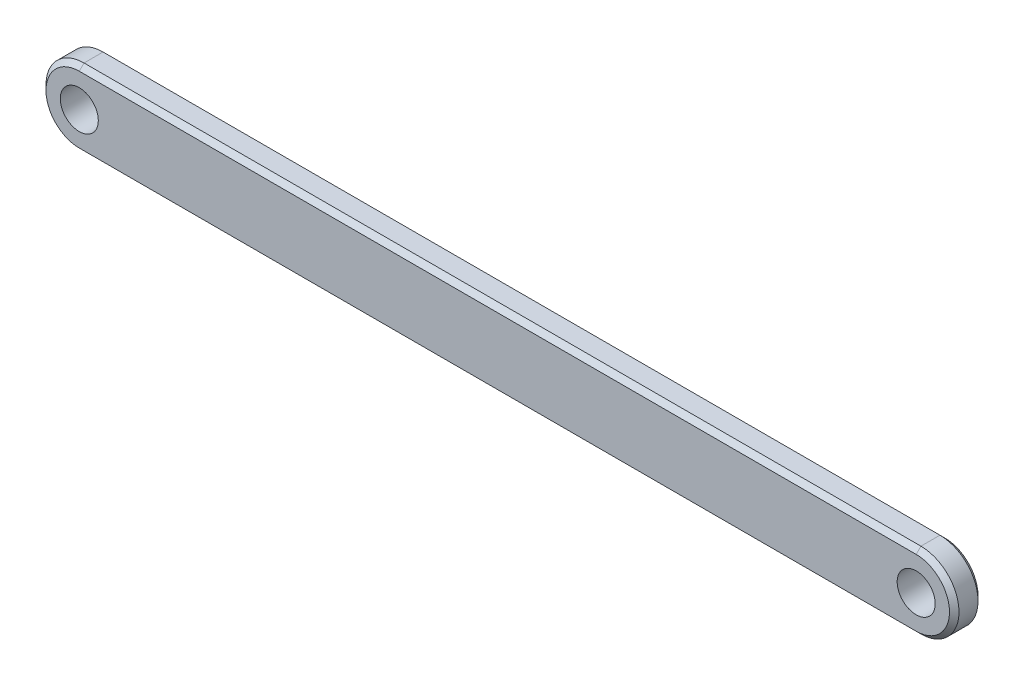
ISO-10303-21;
HEADER;
FILE_DESCRIPTION(('STEP AP214'),'2;1');
FILE_NAME('part.step','',(''),(''),'','','');
FILE_SCHEMA(('AUTOMOTIVE_DESIGN { 1 0 10303 214 1 1 1 1 }'));
ENDSEC;
DATA;
#1=APPLICATION_CONTEXT('core data for automotive mechanical design processes');
#2=APPLICATION_PROTOCOL_DEFINITION('international standard','automotive_design',2000,#1);
#3=PRODUCT_CONTEXT('',#1,'mechanical');
#4=PRODUCT('Part','Part','',(#3));
#5=PRODUCT_RELATED_PRODUCT_CATEGORY('part','',(#4));
#6=PRODUCT_DEFINITION_FORMATION('','',#4);
#7=PRODUCT_DEFINITION_CONTEXT('part definition',#1,'design');
#8=PRODUCT_DEFINITION('design','',#6,#7);
#9=PRODUCT_DEFINITION_SHAPE('','',#8);
#10=(LENGTH_UNIT() NAMED_UNIT(*) SI_UNIT(.MILLI.,.METRE.));
#11=(NAMED_UNIT(*) PLANE_ANGLE_UNIT() SI_UNIT($,.RADIAN.));
#12=(NAMED_UNIT(*) SI_UNIT($,.STERADIAN.) SOLID_ANGLE_UNIT());
#13=UNCERTAINTY_MEASURE_WITH_UNIT(LENGTH_MEASURE(1.E-05),#10,'distance_accuracy_value','');
#14=(GEOMETRIC_REPRESENTATION_CONTEXT(3) GLOBAL_UNCERTAINTY_ASSIGNED_CONTEXT((#13)) GLOBAL_UNIT_ASSIGNED_CONTEXT((#10,
#11,#12)) REPRESENTATION_CONTEXT('',''));
#15=CARTESIAN_POINT('',(0.,0.,0.));
#16=DIRECTION('',(0.,0.,1.));
#17=DIRECTION('',(1.,0.,0.));
#18=AXIS2_PLACEMENT_3D('',#15,#16,#17);
#19=CARTESIAN_POINT('',(-44.,0.,1.5));
#20=DIRECTION('',(0.,0.,1.));
#21=DIRECTION('',(1.,0.,0.));
#22=AXIS2_PLACEMENT_3D('',#19,#20,#21);
#23=PLANE('',#22);
#24=DIRECTION('',(1.,0.,0.));
#25=VECTOR('',#24,1.);
#26=CARTESIAN_POINT('',(44.,-3.49999999999998,1.5));
#27=LINE('',#26,#25);
#28=CARTESIAN_POINT('',(-44.,-3.5,1.5));
#29=VERTEX_POINT('',#28);
#30=CARTESIAN_POINT('',(44.,-3.49999999999998,1.5));
#31=VERTEX_POINT('',#30);
#32=EDGE_CURVE('E57',#29,#31,#27,.T.);
#33=ORIENTED_EDGE('',*,*,#32,.T.);
#34=CARTESIAN_POINT('',(44.,0.,1.5));
#35=DIRECTION('',(0.,0.,1.));
#36=DIRECTION('',(1.,0.,0.));
#37=AXIS2_PLACEMENT_3D('',#34,#35,#36);
#38=CIRCLE('',#37,3.5);
#39=CARTESIAN_POINT('',(44.,3.50000000000002,1.5));
#40=VERTEX_POINT('',#39);
#41=EDGE_CURVE('E11',#31,#40,#38,.T.);
#42=ORIENTED_EDGE('',*,*,#41,.T.);
#43=DIRECTION('',(-1.,0.,0.));
#44=VECTOR('',#43,1.);
#45=CARTESIAN_POINT('',(-44.,3.5,1.5));
#46=LINE('',#45,#44);
#47=CARTESIAN_POINT('',(-44.,3.5,1.5));
#48=VERTEX_POINT('',#47);
#49=EDGE_CURVE('E42',#40,#48,#46,.T.);
#50=ORIENTED_EDGE('',*,*,#49,.T.);
#51=CARTESIAN_POINT('',(-44.,0.,1.5));
#52=DIRECTION('',(0.,0.,1.));
#53=DIRECTION('',(1.,0.,0.));
#54=AXIS2_PLACEMENT_3D('',#51,#52,#53);
#55=CIRCLE('',#54,3.5);
#56=EDGE_CURVE('E197',#48,#29,#55,.T.);
#57=ORIENTED_EDGE('',*,*,#56,.T.);
#58=EDGE_LOOP('',(#33,#42,#50,#57));
#59=FACE_BOUND('',#58,.T.);
#60=CARTESIAN_POINT('',(-44.,0.,1.5));
#61=DIRECTION('',(0.,0.,1.));
#62=DIRECTION('',(1.,0.,0.));
#63=AXIS2_PLACEMENT_3D('',#60,#61,#62);
#64=CIRCLE('',#63,2.);
#65=CARTESIAN_POINT('',(-42.,0.,1.5));
#66=VERTEX_POINT('',#65);
#67=EDGE_CURVE('E170',#66,#66,#64,.T.);
#68=ORIENTED_EDGE('',*,*,#67,.F.);
#69=EDGE_LOOP('',(#68));
#70=FACE_BOUND('',#69,.T.);
#71=CARTESIAN_POINT('',(44.,0.,1.5));
#72=DIRECTION('',(0.,0.,1.));
#73=DIRECTION('',(1.,0.,0.));
#74=AXIS2_PLACEMENT_3D('',#71,#72,#73);
#75=CIRCLE('',#74,2.);
#76=CARTESIAN_POINT('',(46.,0.,1.5));
#77=VERTEX_POINT('',#76);
#78=EDGE_CURVE('E162',#77,#77,#75,.T.);
#79=ORIENTED_EDGE('',*,*,#78,.F.);
#80=EDGE_LOOP('',(#79));
#81=FACE_BOUND('',#80,.T.);
#82=ADVANCED_FACE('F33',(#59,#70,#81),#23,.T.);
#83=CARTESIAN_POINT('',(-44.,0.,-1.5));
#84=DIRECTION('',(0.,0.,1.));
#85=DIRECTION('',(1.,0.,0.));
#86=AXIS2_PLACEMENT_3D('',#83,#84,#85);
#87=PLANE('',#86);
#88=DIRECTION('',(1.,0.,0.));
#89=VECTOR('',#88,1.);
#90=CARTESIAN_POINT('',(-44.,3.5,-1.5));
#91=LINE('',#90,#89);
#92=CARTESIAN_POINT('',(-44.,3.5,-1.5));
#93=VERTEX_POINT('',#92);
#94=CARTESIAN_POINT('',(44.,3.50000000000002,-1.5));
#95=VERTEX_POINT('',#94);
#96=EDGE_CURVE('E184',#93,#95,#91,.T.);
#97=ORIENTED_EDGE('',*,*,#96,.T.);
#98=CARTESIAN_POINT('',(44.,0.,-1.5));
#99=DIRECTION('',(0.,0.,1.));
#100=DIRECTION('',(1.,0.,0.));
#101=AXIS2_PLACEMENT_3D('',#98,#99,#100);
#102=CIRCLE('',#101,3.5);
#103=CARTESIAN_POINT('',(44.,-3.49999999999998,-1.5));
#104=VERTEX_POINT('',#103);
#105=EDGE_CURVE('E113',#95,#104,#102,.F.);
#106=ORIENTED_EDGE('',*,*,#105,.T.);
#107=DIRECTION('',(-1.,0.,0.));
#108=VECTOR('',#107,1.);
#109=CARTESIAN_POINT('',(-44.,-3.5,-1.5));
#110=LINE('',#109,#108);
#111=CARTESIAN_POINT('',(-44.,-3.5,-1.5));
#112=VERTEX_POINT('',#111);
#113=EDGE_CURVE('E182',#104,#112,#110,.T.);
#114=ORIENTED_EDGE('',*,*,#113,.T.);
#115=CARTESIAN_POINT('',(-44.,0.,-1.5));
#116=DIRECTION('',(0.,0.,1.));
#117=DIRECTION('',(1.,0.,0.));
#118=AXIS2_PLACEMENT_3D('',#115,#116,#117);
#119=CIRCLE('',#118,3.5);
#120=EDGE_CURVE('E180',#112,#93,#119,.F.);
#121=ORIENTED_EDGE('',*,*,#120,.T.);
#122=EDGE_LOOP('',(#97,#106,#114,#121));
#123=FACE_BOUND('',#122,.T.);
#124=CARTESIAN_POINT('',(-44.,0.,-1.5));
#125=DIRECTION('',(0.,0.,1.));
#126=DIRECTION('',(1.,0.,0.));
#127=AXIS2_PLACEMENT_3D('',#124,#125,#126);
#128=CIRCLE('',#127,2.);
#129=CARTESIAN_POINT('',(-42.,0.,-1.5));
#130=VERTEX_POINT('',#129);
#131=EDGE_CURVE('E167',#130,#130,#128,.T.);
#132=ORIENTED_EDGE('',*,*,#131,.T.);
#133=EDGE_LOOP('',(#132));
#134=FACE_BOUND('',#133,.T.);
#135=CARTESIAN_POINT('',(44.,0.,-1.5));
#136=DIRECTION('',(0.,0.,1.));
#137=DIRECTION('',(1.,0.,0.));
#138=AXIS2_PLACEMENT_3D('',#135,#136,#137);
#139=CIRCLE('',#138,2.);
#140=CARTESIAN_POINT('',(46.,0.,-1.5));
#141=VERTEX_POINT('',#140);
#142=EDGE_CURVE('E156',#141,#141,#139,.T.);
#143=ORIENTED_EDGE('',*,*,#142,.T.);
#144=EDGE_LOOP('',(#143));
#145=FACE_BOUND('',#144,.T.);
#146=ADVANCED_FACE('F226',(#123,#134,#145),#87,.F.);
#147=CARTESIAN_POINT('',(-44.,0.,1.5));
#148=DIRECTION('',(0.,0.,-1.));
#149=DIRECTION('',(-1.,0.,0.));
#150=AXIS2_PLACEMENT_3D('',#147,#148,#149);
#151=CYLINDRICAL_SURFACE('',#150,4.);
#152=DIRECTION('',(0.,0.,-1.));
#153=VECTOR('',#152,1.);
#154=CARTESIAN_POINT('',(-44.,4.,1.5));
#155=LINE('',#154,#153);
#156=CARTESIAN_POINT('',(-44.,4.,1.));
#157=VERTEX_POINT('',#156);
#158=CARTESIAN_POINT('',(-44.,4.,-1.00000000000002));
#159=VERTEX_POINT('',#158);
#160=EDGE_CURVE('E108',#157,#159,#155,.T.);
#161=ORIENTED_EDGE('',*,*,#160,.T.);
#162=CARTESIAN_POINT('',(-44.,0.,-1.00000000000002));
#163=DIRECTION('',(0.,0.,1.));
#164=DIRECTION('',(1.,0.,0.));
#165=AXIS2_PLACEMENT_3D('',#162,#163,#164);
#166=CIRCLE('',#165,4.);
#167=CARTESIAN_POINT('',(-44.,-4.,-1.00000000000002));
#168=VERTEX_POINT('',#167);
#169=EDGE_CURVE('E195',#159,#168,#166,.T.);
#170=ORIENTED_EDGE('',*,*,#169,.T.);
#171=DIRECTION('',(0.,0.,-1.));
#172=VECTOR('',#171,1.);
#173=CARTESIAN_POINT('',(-44.,-4.,1.5));
#174=LINE('',#173,#172);
#175=CARTESIAN_POINT('',(-44.,-4.,1.));
#176=VERTEX_POINT('',#175);
#177=EDGE_CURVE('E129',#176,#168,#174,.T.);
#178=ORIENTED_EDGE('',*,*,#177,.F.);
#179=CARTESIAN_POINT('',(-44.,0.,1.));
#180=DIRECTION('',(0.,0.,1.));
#181=DIRECTION('',(1.,0.,0.));
#182=AXIS2_PLACEMENT_3D('',#179,#180,#181);
#183=CIRCLE('',#182,4.);
#184=EDGE_CURVE('E193',#176,#157,#183,.F.);
#185=ORIENTED_EDGE('',*,*,#184,.T.);
#186=EDGE_LOOP('',(#161,#170,#178,#185));
#187=FACE_BOUND('',#186,.T.);
#188=ADVANCED_FACE('F208',(#187),#151,.T.);
#189=CARTESIAN_POINT('',(-44.,-4.,1.5));
#190=DIRECTION('',(0.,1.,0.));
#191=DIRECTION('',(-1.,0.,0.));
#192=AXIS2_PLACEMENT_3D('',#189,#190,#191);
#193=PLANE('',#192);
#194=ORIENTED_EDGE('',*,*,#177,.T.);
#195=DIRECTION('',(1.,0.,0.));
#196=VECTOR('',#195,1.);
#197=CARTESIAN_POINT('',(-44.,-4.,-1.00000000000002));
#198=LINE('',#197,#196);
#199=CARTESIAN_POINT('',(44.,-3.99999999999998,-1.00000000000002));
#200=VERTEX_POINT('',#199);
#201=EDGE_CURVE('E191',#168,#200,#198,.T.);
#202=ORIENTED_EDGE('',*,*,#201,.T.);
#203=DIRECTION('',(0.,0.,-1.));
#204=VECTOR('',#203,1.);
#205=CARTESIAN_POINT('',(44.,-3.99999999999998,1.5));
#206=LINE('',#205,#204);
#207=CARTESIAN_POINT('',(44.,-3.99999999999998,1.));
#208=VERTEX_POINT('',#207);
#209=EDGE_CURVE('E124',#208,#200,#206,.T.);
#210=ORIENTED_EDGE('',*,*,#209,.F.);
#211=DIRECTION('',(-1.,0.,0.));
#212=VECTOR('',#211,1.);
#213=CARTESIAN_POINT('',(-44.,-4.,1.));
#214=LINE('',#213,#212);
#215=EDGE_CURVE('E189',#208,#176,#214,.T.);
#216=ORIENTED_EDGE('',*,*,#215,.T.);
#217=EDGE_LOOP('',(#194,#202,#210,#216));
#218=FACE_BOUND('',#217,.T.);
#219=ADVANCED_FACE('F206',(#218),#193,.F.);
#220=CARTESIAN_POINT('',(44.,0.,1.5));
#221=DIRECTION('',(0.,0.,-1.));
#222=DIRECTION('',(-1.,0.,0.));
#223=AXIS2_PLACEMENT_3D('',#220,#221,#222);
#224=CYLINDRICAL_SURFACE('',#223,4.);
#225=ORIENTED_EDGE('',*,*,#209,.T.);
#226=CARTESIAN_POINT('',(44.,0.,-1.00000000000002));
#227=DIRECTION('',(0.,0.,1.));
#228=DIRECTION('',(1.,0.,0.));
#229=AXIS2_PLACEMENT_3D('',#226,#227,#228);
#230=CIRCLE('',#229,4.);
#231=CARTESIAN_POINT('',(44.,4.00000000000002,-1.00000000000002));
#232=VERTEX_POINT('',#231);
#233=EDGE_CURVE('E123',#200,#232,#230,.T.);
#234=ORIENTED_EDGE('',*,*,#233,.T.);
#235=DIRECTION('',(0.,0.,-1.));
#236=VECTOR('',#235,1.);
#237=CARTESIAN_POINT('',(44.,4.00000000000002,1.5));
#238=LINE('',#237,#236);
#239=CARTESIAN_POINT('',(44.,4.00000000000002,1.));
#240=VERTEX_POINT('',#239);
#241=EDGE_CURVE('E106',#240,#232,#238,.T.);
#242=ORIENTED_EDGE('',*,*,#241,.F.);
#243=CARTESIAN_POINT('',(44.,0.,1.));
#244=DIRECTION('',(0.,0.,1.));
#245=DIRECTION('',(1.,0.,0.));
#246=AXIS2_PLACEMENT_3D('',#243,#244,#245);
#247=CIRCLE('',#246,4.);
#248=EDGE_CURVE('E120',#240,#208,#247,.F.);
#249=ORIENTED_EDGE('',*,*,#248,.T.);
#250=EDGE_LOOP('',(#225,#234,#242,#249));
#251=FACE_BOUND('',#250,.T.);
#252=ADVANCED_FACE('F119',(#251),#224,.T.);
#253=CARTESIAN_POINT('',(-44.,4.,1.5));
#254=DIRECTION('',(0.,-1.,0.));
#255=DIRECTION('',(1.,0.,0.));
#256=AXIS2_PLACEMENT_3D('',#253,#254,#255);
#257=PLANE('',#256);
#258=ORIENTED_EDGE('',*,*,#241,.T.);
#259=DIRECTION('',(-1.,0.,0.));
#260=VECTOR('',#259,1.);
#261=CARTESIAN_POINT('',(-44.,4.,-1.00000000000002));
#262=LINE('',#261,#260);
#263=EDGE_CURVE('E112',#232,#159,#262,.T.);
#264=ORIENTED_EDGE('',*,*,#263,.T.);
#265=ORIENTED_EDGE('',*,*,#160,.F.);
#266=DIRECTION('',(1.,0.,0.));
#267=VECTOR('',#266,1.);
#268=CARTESIAN_POINT('',(44.,4.00000000000002,1.));
#269=LINE('',#268,#267);
#270=EDGE_CURVE('E103',#157,#240,#269,.T.);
#271=ORIENTED_EDGE('',*,*,#270,.T.);
#272=EDGE_LOOP('',(#258,#264,#265,#271));
#273=FACE_BOUND('',#272,.T.);
#274=ADVANCED_FACE('F105',(#273),#257,.F.);
#275=CARTESIAN_POINT('',(-44.,0.,1.5));
#276=DIRECTION('',(0.,0.,-1.));
#277=DIRECTION('',(-1.,0.,0.));
#278=AXIS2_PLACEMENT_3D('',#275,#276,#277);
#279=CYLINDRICAL_SURFACE('',#278,2.);
#280=ORIENTED_EDGE('',*,*,#67,.T.);
#281=EDGE_LOOP('',(#280));
#282=FACE_BOUND('',#281,.T.);
#283=ORIENTED_EDGE('',*,*,#131,.F.);
#284=EDGE_LOOP('',(#283));
#285=FACE_BOUND('',#284,.T.);
#286=ADVANCED_FACE('F234',(#282,#285),#279,.F.);
#287=CARTESIAN_POINT('',(44.,0.,1.5));
#288=DIRECTION('',(0.,0.,-1.));
#289=DIRECTION('',(-1.,0.,0.));
#290=AXIS2_PLACEMENT_3D('',#287,#288,#289);
#291=CYLINDRICAL_SURFACE('',#290,2.);
#292=ORIENTED_EDGE('',*,*,#78,.T.);
#293=EDGE_LOOP('',(#292));
#294=FACE_BOUND('',#293,.T.);
#295=ORIENTED_EDGE('',*,*,#142,.F.);
#296=EDGE_LOOP('',(#295));
#297=FACE_BOUND('',#296,.T.);
#298=ADVANCED_FACE('F266',(#294,#297),#291,.F.);
#299=CARTESIAN_POINT('',(-44.,0.,-1.00000000000002));
#300=DIRECTION('',(0.,0.,1.));
#301=DIRECTION('',(1.,0.,0.));
#302=AXIS2_PLACEMENT_3D('',#299,#300,#301);
#303=CONICAL_SURFACE('',#302,4.,0.785398163397466);
#304=DIRECTION('',(0.,0.70710678118656,0.707106781186535));
#305=VECTOR('',#304,1.);
#306=CARTESIAN_POINT('',(-44.,3.5,-1.5));
#307=LINE('',#306,#305);
#308=EDGE_CURVE('E148',#93,#159,#307,.T.);
#309=ORIENTED_EDGE('',*,*,#308,.F.);
#310=ORIENTED_EDGE('',*,*,#120,.F.);
#311=DIRECTION('',(0.,0.70710678118656,-0.707106781186535));
#312=VECTOR('',#311,1.);
#313=CARTESIAN_POINT('',(-44.,-4.,-1.00000000000002));
#314=LINE('',#313,#312);
#315=EDGE_CURVE('E136',#168,#112,#314,.T.);
#316=ORIENTED_EDGE('',*,*,#315,.F.);
#317=ORIENTED_EDGE('',*,*,#169,.F.);
#318=EDGE_LOOP('',(#309,#310,#316,#317));
#319=FACE_BOUND('',#318,.T.);
#320=ADVANCED_FACE('F211',(#319),#303,.T.);
#321=CARTESIAN_POINT('',(-44.,-4.,-1.00000000000002));
#322=DIRECTION('',(0.,0.707106781186535,0.70710678118656));
#323=DIRECTION('',(1.,0.,0.));
#324=AXIS2_PLACEMENT_3D('',#321,#322,#323);
#325=PLANE('',#324);
#326=ORIENTED_EDGE('',*,*,#315,.T.);
#327=ORIENTED_EDGE('',*,*,#113,.F.);
#328=DIRECTION('',(0.,0.70710678118656,-0.707106781186535));
#329=VECTOR('',#328,1.);
#330=CARTESIAN_POINT('',(44.,-3.99999999999998,-1.00000000000002));
#331=LINE('',#330,#329);
#332=EDGE_CURVE('E142',#200,#104,#331,.T.);
#333=ORIENTED_EDGE('',*,*,#332,.F.);
#334=ORIENTED_EDGE('',*,*,#201,.F.);
#335=EDGE_LOOP('',(#326,#327,#333,#334));
#336=FACE_BOUND('',#335,.T.);
#337=ADVANCED_FACE('F214',(#336),#325,.F.);
#338=CARTESIAN_POINT('',(-44.,4.,-1.00000000000002));
#339=DIRECTION('',(0.,-0.707106781186535,0.70710678118656));
#340=DIRECTION('',(-1.,0.,0.));
#341=AXIS2_PLACEMENT_3D('',#338,#339,#340);
#342=PLANE('',#341);
#343=ORIENTED_EDGE('',*,*,#308,.T.);
#344=ORIENTED_EDGE('',*,*,#263,.F.);
#345=DIRECTION('',(0.,0.70710678118656,0.707106781186535));
#346=VECTOR('',#345,1.);
#347=CARTESIAN_POINT('',(44.,3.50000000000002,-1.5));
#348=LINE('',#347,#346);
#349=EDGE_CURVE('E139',#95,#232,#348,.T.);
#350=ORIENTED_EDGE('',*,*,#349,.F.);
#351=ORIENTED_EDGE('',*,*,#96,.F.);
#352=EDGE_LOOP('',(#343,#344,#350,#351));
#353=FACE_BOUND('',#352,.T.);
#354=ADVANCED_FACE('F217',(#353),#342,.F.);
#355=CARTESIAN_POINT('',(44.,0.,-1.00000000000002));
#356=DIRECTION('',(0.,0.,1.));
#357=DIRECTION('',(1.,0.,0.));
#358=AXIS2_PLACEMENT_3D('',#355,#356,#357);
#359=CONICAL_SURFACE('',#358,4.,0.785398163397466);
#360=ORIENTED_EDGE('',*,*,#332,.T.);
#361=ORIENTED_EDGE('',*,*,#105,.F.);
#362=ORIENTED_EDGE('',*,*,#349,.T.);
#363=ORIENTED_EDGE('',*,*,#233,.F.);
#364=EDGE_LOOP('',(#360,#361,#362,#363));
#365=FACE_BOUND('',#364,.T.);
#366=ADVANCED_FACE('F215',(#365),#359,.T.);
#367=CARTESIAN_POINT('',(-44.,0.,1.5));
#368=DIRECTION('',(0.,0.,-1.));
#369=DIRECTION('',(-1.,0.,0.));
#370=AXIS2_PLACEMENT_3D('',#367,#368,#369);
#371=CONICAL_SURFACE('',#370,3.5,0.785398163397452);
#372=DIRECTION('',(0.,-0.70710678118655,0.707106781186545));
#373=VECTOR('',#372,1.);
#374=CARTESIAN_POINT('',(-44.,4.,1.));
#375=LINE('',#374,#373);
#376=EDGE_CURVE('E133',#157,#48,#375,.T.);
#377=ORIENTED_EDGE('',*,*,#376,.F.);
#378=ORIENTED_EDGE('',*,*,#184,.F.);
#379=DIRECTION('',(0.,-0.70710678118655,-0.707106781186545));
#380=VECTOR('',#379,1.);
#381=CARTESIAN_POINT('',(-44.,-3.5,1.5));
#382=LINE('',#381,#380);
#383=EDGE_CURVE('E37',#29,#176,#382,.T.);
#384=ORIENTED_EDGE('',*,*,#383,.F.);
#385=ORIENTED_EDGE('',*,*,#56,.F.);
#386=EDGE_LOOP('',(#377,#378,#384,#385));
#387=FACE_BOUND('',#386,.T.);
#388=ADVANCED_FACE('F35',(#387),#371,.T.);
#389=CARTESIAN_POINT('',(-44.,-3.5,1.5));
#390=DIRECTION('',(0.,-0.707106781186545,0.70710678118655));
#391=DIRECTION('',(-1.,0.,0.));
#392=AXIS2_PLACEMENT_3D('',#389,#390,#391);
#393=PLANE('',#392);
#394=ORIENTED_EDGE('',*,*,#383,.T.);
#395=ORIENTED_EDGE('',*,*,#215,.F.);
#396=DIRECTION('',(0.,-0.70710678118655,-0.707106781186545));
#397=VECTOR('',#396,1.);
#398=CARTESIAN_POINT('',(44.,-3.49999999999998,1.5));
#399=LINE('',#398,#397);
#400=EDGE_CURVE('E127',#31,#208,#399,.T.);
#401=ORIENTED_EDGE('',*,*,#400,.F.);
#402=ORIENTED_EDGE('',*,*,#32,.F.);
#403=EDGE_LOOP('',(#394,#395,#401,#402));
#404=FACE_BOUND('',#403,.T.);
#405=ADVANCED_FACE('F203',(#404),#393,.T.);
#406=CARTESIAN_POINT('',(-44.,3.5,1.5));
#407=DIRECTION('',(0.,0.707106781186545,0.70710678118655));
#408=DIRECTION('',(1.,0.,0.));
#409=AXIS2_PLACEMENT_3D('',#406,#407,#408);
#410=PLANE('',#409);
#411=ORIENTED_EDGE('',*,*,#376,.T.);
#412=ORIENTED_EDGE('',*,*,#49,.F.);
#413=DIRECTION('',(0.,-0.70710678118655,0.707106781186545));
#414=VECTOR('',#413,1.);
#415=CARTESIAN_POINT('',(44.,4.00000000000002,1.));
#416=LINE('',#415,#414);
#417=EDGE_CURVE('E50',#240,#40,#416,.T.);
#418=ORIENTED_EDGE('',*,*,#417,.F.);
#419=ORIENTED_EDGE('',*,*,#270,.F.);
#420=EDGE_LOOP('',(#411,#412,#418,#419));
#421=FACE_BOUND('',#420,.T.);
#422=ADVANCED_FACE('F131',(#421),#410,.T.);
#423=CARTESIAN_POINT('',(44.,0.,1.5));
#424=DIRECTION('',(0.,0.,-1.));
#425=DIRECTION('',(-1.,0.,0.));
#426=AXIS2_PLACEMENT_3D('',#423,#424,#425);
#427=CONICAL_SURFACE('',#426,3.5,0.785398163397452);
#428=ORIENTED_EDGE('',*,*,#400,.T.);
#429=ORIENTED_EDGE('',*,*,#248,.F.);
#430=ORIENTED_EDGE('',*,*,#417,.T.);
#431=ORIENTED_EDGE('',*,*,#41,.F.);
#432=EDGE_LOOP('',(#428,#429,#430,#431));
#433=FACE_BOUND('',#432,.T.);
#434=ADVANCED_FACE('F126',(#433),#427,.T.);
#435=CLOSED_SHELL('',(#82,#146,#188,#219,#252,#274,#286,#298,#320,#337,#354,#366,#388,#405,#422,#434));
#436=MANIFOLD_SOLID_BREP('B2',#435);
#437=ADVANCED_BREP_SHAPE_REPRESENTATION('',(#18,#436),#14);
#438=SHAPE_DEFINITION_REPRESENTATION(#9,#437);
ENDSEC;
END-ISO-10303-21;
